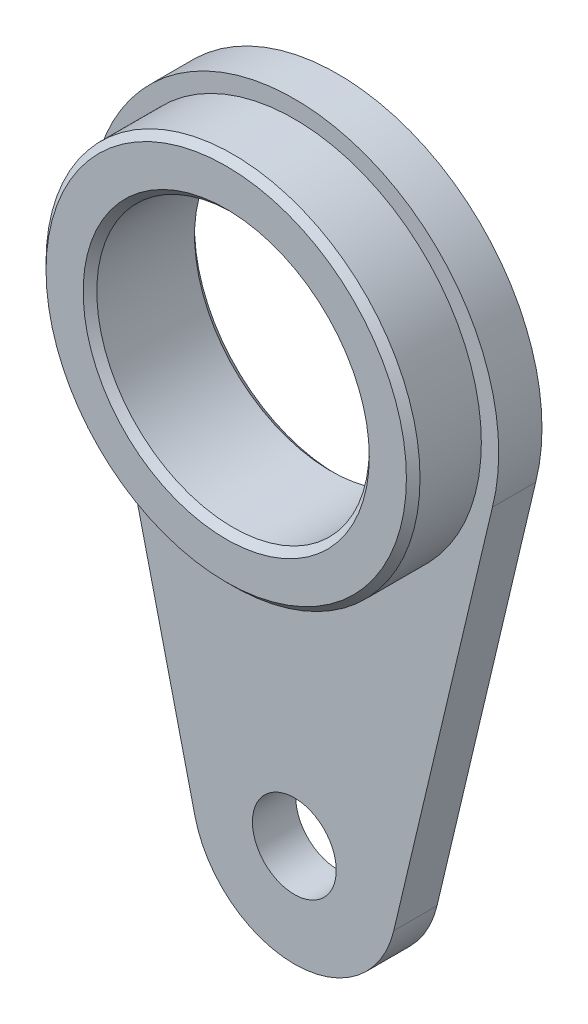
ISO-10303-21;
HEADER;
FILE_DESCRIPTION(('STEP AP214'),'2;1');
FILE_NAME('part.step','',(''),(''),'','','');
FILE_SCHEMA(('AUTOMOTIVE_DESIGN { 1 0 10303 214 1 1 1 1 }'));
ENDSEC;
DATA;
#1=APPLICATION_CONTEXT('core data for automotive mechanical design processes');
#2=APPLICATION_PROTOCOL_DEFINITION('international standard','automotive_design',2000,#1);
#3=PRODUCT_CONTEXT('',#1,'mechanical');
#4=PRODUCT('Part','Part','',(#3));
#5=PRODUCT_RELATED_PRODUCT_CATEGORY('part','',(#4));
#6=PRODUCT_DEFINITION_FORMATION('','',#4);
#7=PRODUCT_DEFINITION_CONTEXT('part definition',#1,'design');
#8=PRODUCT_DEFINITION('design','',#6,#7);
#9=PRODUCT_DEFINITION_SHAPE('','',#8);
#10=(LENGTH_UNIT() NAMED_UNIT(*) SI_UNIT(.MILLI.,.METRE.));
#11=(NAMED_UNIT(*) PLANE_ANGLE_UNIT() SI_UNIT($,.RADIAN.));
#12=(NAMED_UNIT(*) SI_UNIT($,.STERADIAN.) SOLID_ANGLE_UNIT());
#13=UNCERTAINTY_MEASURE_WITH_UNIT(LENGTH_MEASURE(1.E-05),#10,'distance_accuracy_value','');
#14=(GEOMETRIC_REPRESENTATION_CONTEXT(3) GLOBAL_UNCERTAINTY_ASSIGNED_CONTEXT((#13)) GLOBAL_UNIT_ASSIGNED_CONTEXT((#10,
#11,#12)) REPRESENTATION_CONTEXT('',''));
#15=CARTESIAN_POINT('',(0.,0.,0.));
#16=DIRECTION('',(0.,0.,1.));
#17=DIRECTION('',(1.,0.,0.));
#18=AXIS2_PLACEMENT_3D('',#15,#16,#17);
#19=CARTESIAN_POINT('',(0.,0.,6.35));
#20=DIRECTION('',(0.,0.,1.));
#21=DIRECTION('',(1.,0.,0.));
#22=AXIS2_PLACEMENT_3D('',#19,#20,#21);
#23=PLANE('',#22);
#24=CARTESIAN_POINT('',(0.,0.,6.34999999999999));
#25=DIRECTION('',(0.,0.,1.));
#26=DIRECTION('',(1.,0.,0.));
#27=AXIS2_PLACEMENT_3D('',#24,#25,#26);
#28=CIRCLE('',#27,27.45);
#29=CARTESIAN_POINT('',(27.4499999999998,0.,6.34999999999999));
#30=VERTEX_POINT('',#29);
#31=EDGE_CURVE('E128',#30,#30,#28,.T.);
#32=ORIENTED_EDGE('',*,*,#31,.F.);
#33=EDGE_LOOP('',(#32));
#34=FACE_BOUND('',#33,.T.);
#35=CARTESIAN_POINT('',(0.,0.,6.35));
#36=DIRECTION('',(0.,0.,1.));
#37=DIRECTION('',(1.,0.,0.));
#38=AXIS2_PLACEMENT_3D('',#35,#36,#37);
#39=CIRCLE('',#38,30.);
#40=CARTESIAN_POINT('',(29.0780134048297,-7.38032088926599,6.34999999999999));
#41=VERTEX_POINT('',#40);
#42=CARTESIAN_POINT('',(-29.0780134048301,-7.38032088926599,6.35));
#43=VERTEX_POINT('',#42);
#44=EDGE_CURVE('E103',#41,#43,#39,.T.);
#45=ORIENTED_EDGE('',*,*,#44,.T.);
#46=DIRECTION('',(0.230711965147028,-0.973022090775948,0.));
#47=VECTOR('',#46,1.);
#48=CARTESIAN_POINT('',(-29.0780134048301,-7.38032088926599,6.35));
#49=LINE('',#48,#47);
#50=CARTESIAN_POINT('',(-14.5953313616395,-68.4606794772056,6.34999999999999));
#51=VERTEX_POINT('',#50);
#52=EDGE_CURVE('E98',#43,#51,#49,.T.);
#53=ORIENTED_EDGE('',*,*,#52,.T.);
#54=CARTESIAN_POINT('',(-2.22044604925031E-13,-65.0000000000002,6.35));
#55=DIRECTION('',(0.,0.,1.));
#56=DIRECTION('',(1.,0.,0.));
#57=AXIS2_PLACEMENT_3D('',#54,#55,#56);
#58=CIRCLE('',#57,15.);
#59=CARTESIAN_POINT('',(14.5953313616388,-68.4606794772054,6.34999999999999));
#60=VERTEX_POINT('',#59);
#61=EDGE_CURVE('E101',#51,#60,#58,.T.);
#62=ORIENTED_EDGE('',*,*,#61,.T.);
#63=DIRECTION('',(0.230711965147028,0.973022090775948,0.));
#64=VECTOR('',#63,1.);
#65=CARTESIAN_POINT('',(14.5953313616388,-68.4606794772054,6.34999999999999));
#66=LINE('',#65,#64);
#67=EDGE_CURVE('E67',#60,#41,#66,.T.);
#68=ORIENTED_EDGE('',*,*,#67,.T.);
#69=EDGE_LOOP('',(#45,#53,#62,#68));
#70=FACE_BOUND('',#69,.T.);
#71=CARTESIAN_POINT('',(-2.22044604925031E-13,-65.0000000000002,6.35));
#72=DIRECTION('',(0.,0.,1.));
#73=DIRECTION('',(1.,0.,0.));
#74=AXIS2_PLACEMENT_3D('',#71,#72,#73);
#75=CIRCLE('',#74,6.15);
#76=CARTESIAN_POINT('',(-6.15000000000022,-65.0000000000002,6.35));
#77=VERTEX_POINT('',#76);
#78=EDGE_CURVE('E121',#77,#77,#75,.T.);
#79=ORIENTED_EDGE('',*,*,#78,.F.);
#80=EDGE_LOOP('',(#79));
#81=FACE_BOUND('',#80,.T.);
#82=ADVANCED_FACE('F50',(#34,#70,#81),#23,.T.);
#83=CARTESIAN_POINT('',(0.,0.,0.));
#84=DIRECTION('',(0.,0.,1.));
#85=DIRECTION('',(1.,0.,0.));
#86=AXIS2_PLACEMENT_3D('',#83,#84,#85);
#87=PLANE('',#86);
#88=CARTESIAN_POINT('',(0.,0.,0.));
#89=DIRECTION('',(0.,0.,1.));
#90=DIRECTION('',(1.,0.,0.));
#91=AXIS2_PLACEMENT_3D('',#88,#89,#90);
#92=CIRCLE('',#91,21.);
#93=CARTESIAN_POINT('',(21.,0.,0.));
#94=VERTEX_POINT('',#93);
#95=EDGE_CURVE('E135',#94,#94,#92,.T.);
#96=ORIENTED_EDGE('',*,*,#95,.T.);
#97=EDGE_LOOP('',(#96));
#98=FACE_BOUND('',#97,.T.);
#99=CARTESIAN_POINT('',(0.,0.,0.));
#100=DIRECTION('',(0.,0.,1.));
#101=DIRECTION('',(1.,0.,0.));
#102=AXIS2_PLACEMENT_3D('',#99,#100,#101);
#103=CIRCLE('',#102,30.);
#104=CARTESIAN_POINT('',(29.07801340483,-7.38032088926577,0.));
#105=VERTEX_POINT('',#104);
#106=CARTESIAN_POINT('',(-29.0780134048298,-7.38032088926599,0.));
#107=VERTEX_POINT('',#106);
#108=EDGE_CURVE('E118',#105,#107,#103,.T.);
#109=ORIENTED_EDGE('',*,*,#108,.F.);
#110=DIRECTION('',(0.230711965147028,0.973022090775948,0.));
#111=VECTOR('',#110,1.);
#112=CARTESIAN_POINT('',(14.595331361639,-68.4606794772056,0.));
#113=LINE('',#112,#111);
#114=CARTESIAN_POINT('',(14.595331361639,-68.4606794772056,0.));
#115=VERTEX_POINT('',#114);
#116=EDGE_CURVE('E90',#115,#105,#113,.T.);
#117=ORIENTED_EDGE('',*,*,#116,.F.);
#118=CARTESIAN_POINT('',(1.11022302462516E-13,-65.0000000000004,0.));
#119=DIRECTION('',(0.,0.,1.));
#120=DIRECTION('',(1.,0.,0.));
#121=AXIS2_PLACEMENT_3D('',#118,#119,#120);
#122=CIRCLE('',#121,15.);
#123=CARTESIAN_POINT('',(-14.5953313616392,-68.4606794772058,0.));
#124=VERTEX_POINT('',#123);
#125=EDGE_CURVE('E84',#124,#115,#122,.T.);
#126=ORIENTED_EDGE('',*,*,#125,.F.);
#127=DIRECTION('',(0.230711965147028,-0.973022090775948,0.));
#128=VECTOR('',#127,1.);
#129=CARTESIAN_POINT('',(-29.0780134048298,-7.38032088926599,0.));
#130=LINE('',#129,#128);
#131=EDGE_CURVE('E108',#107,#124,#130,.T.);
#132=ORIENTED_EDGE('',*,*,#131,.F.);
#133=EDGE_LOOP('',(#109,#117,#126,#132));
#134=FACE_BOUND('',#133,.T.);
#135=CARTESIAN_POINT('',(1.11022302462516E-13,-65.0000000000004,0.));
#136=DIRECTION('',(0.,0.,1.));
#137=DIRECTION('',(1.,0.,0.));
#138=AXIS2_PLACEMENT_3D('',#135,#136,#137);
#139=CIRCLE('',#138,6.15);
#140=CARTESIAN_POINT('',(-6.15000000000022,-65.0000000000002,0.));
#141=VERTEX_POINT('',#140);
#142=EDGE_CURVE('E200',#141,#141,#139,.T.);
#143=ORIENTED_EDGE('',*,*,#142,.T.);
#144=EDGE_LOOP('',(#143));
#145=FACE_BOUND('',#144,.T.);
#146=ADVANCED_FACE('F166',(#98,#134,#145),#87,.F.);
#147=CARTESIAN_POINT('',(0.,0.,6.35));
#148=DIRECTION('',(0.,0.,-1.));
#149=DIRECTION('',(-1.,0.,0.));
#150=AXIS2_PLACEMENT_3D('',#147,#148,#149);
#151=CYLINDRICAL_SURFACE('',#150,30.);
#152=ORIENTED_EDGE('',*,*,#108,.T.);
#153=DIRECTION('',(0.,0.,-1.));
#154=VECTOR('',#153,1.);
#155=CARTESIAN_POINT('',(-29.0780134048301,-7.38032088926599,6.35));
#156=LINE('',#155,#154);
#157=EDGE_CURVE('E109',#43,#107,#156,.T.);
#158=ORIENTED_EDGE('',*,*,#157,.F.);
#159=ORIENTED_EDGE('',*,*,#44,.F.);
#160=DIRECTION('',(0.,0.,-1.));
#161=VECTOR('',#160,1.);
#162=CARTESIAN_POINT('',(29.0780134048297,-7.38032088926599,6.34999999999999));
#163=LINE('',#162,#161);
#164=EDGE_CURVE('E114',#41,#105,#163,.T.);
#165=ORIENTED_EDGE('',*,*,#164,.T.);
#166=EDGE_LOOP('',(#152,#158,#159,#165));
#167=FACE_BOUND('',#166,.T.);
#168=ADVANCED_FACE('F172',(#167),#151,.T.);
#169=CARTESIAN_POINT('',(-29.0780134048301,-7.38032088926599,6.35));
#170=DIRECTION('',(0.973022090775948,0.230711965147028,0.));
#171=DIRECTION('',(-0.230711965147028,0.973022090775948,0.));
#172=AXIS2_PLACEMENT_3D('',#169,#170,#171);
#173=PLANE('',#172);
#174=ORIENTED_EDGE('',*,*,#131,.T.);
#175=DIRECTION('',(0.,0.,-1.));
#176=VECTOR('',#175,1.);
#177=CARTESIAN_POINT('',(-14.5953313616395,-68.4606794772056,6.34999999999999));
#178=LINE('',#177,#176);
#179=EDGE_CURVE('E106',#51,#124,#178,.T.);
#180=ORIENTED_EDGE('',*,*,#179,.F.);
#181=ORIENTED_EDGE('',*,*,#52,.F.);
#182=ORIENTED_EDGE('',*,*,#157,.T.);
#183=EDGE_LOOP('',(#174,#180,#181,#182));
#184=FACE_BOUND('',#183,.T.);
#185=ADVANCED_FACE('F107',(#184),#173,.F.);
#186=CARTESIAN_POINT('',(-2.22044604925031E-13,-65.0000000000002,6.35));
#187=DIRECTION('',(0.,0.,-1.));
#188=DIRECTION('',(-1.,0.,0.));
#189=AXIS2_PLACEMENT_3D('',#186,#187,#188);
#190=CYLINDRICAL_SURFACE('',#189,15.);
#191=ORIENTED_EDGE('',*,*,#125,.T.);
#192=DIRECTION('',(0.,0.,-1.));
#193=VECTOR('',#192,1.);
#194=CARTESIAN_POINT('',(14.5953313616388,-68.4606794772054,6.34999999999999));
#195=LINE('',#194,#193);
#196=EDGE_CURVE('E110',#60,#115,#195,.T.);
#197=ORIENTED_EDGE('',*,*,#196,.F.);
#198=ORIENTED_EDGE('',*,*,#61,.F.);
#199=ORIENTED_EDGE('',*,*,#179,.T.);
#200=EDGE_LOOP('',(#191,#197,#198,#199));
#201=FACE_BOUND('',#200,.T.);
#202=ADVANCED_FACE('F112',(#201),#190,.T.);
#203=CARTESIAN_POINT('',(14.5953313616388,-68.4606794772054,6.34999999999999));
#204=DIRECTION('',(-0.973022090775948,0.230711965147028,0.));
#205=DIRECTION('',(-0.230711965147028,-0.973022090775948,0.));
#206=AXIS2_PLACEMENT_3D('',#203,#204,#205);
#207=PLANE('',#206);
#208=ORIENTED_EDGE('',*,*,#116,.T.);
#209=ORIENTED_EDGE('',*,*,#164,.F.);
#210=ORIENTED_EDGE('',*,*,#67,.F.);
#211=ORIENTED_EDGE('',*,*,#196,.T.);
#212=EDGE_LOOP('',(#208,#209,#210,#211));
#213=FACE_BOUND('',#212,.T.);
#214=ADVANCED_FACE('F178',(#213),#207,.F.);
#215=CARTESIAN_POINT('',(-2.22044604925031E-13,-65.0000000000002,6.35));
#216=DIRECTION('',(0.,0.,-1.));
#217=DIRECTION('',(-1.,0.,0.));
#218=AXIS2_PLACEMENT_3D('',#215,#216,#217);
#219=CYLINDRICAL_SURFACE('',#218,6.15);
#220=CARTESIAN_POINT('',(-6.15000000000022,-65.0000000000002,6.35));
#221=CARTESIAN_POINT('',(-6.15000000000022,-65.0000000000002,6.28385416666666));
#222=CARTESIAN_POINT('',(-6.15000000000022,-65.0000000000002,6.21770833333333));
#223=CARTESIAN_POINT('',(-6.15000000000022,-65.0000000000002,6.08541666666666));
#224=CARTESIAN_POINT('',(-6.15000000000022,-65.0000000000002,6.01927083333333));
#225=CARTESIAN_POINT('',(-6.15000000000022,-65.0000000000002,5.88697916666666));
#226=CARTESIAN_POINT('',(-6.15000000000022,-65.0000000000002,5.82083333333333));
#227=CARTESIAN_POINT('',(-6.15000000000022,-65.0000000000002,5.68854166666666));
#228=CARTESIAN_POINT('',(-6.15000000000022,-65.0000000000002,5.62239583333333));
#229=CARTESIAN_POINT('',(-6.15000000000022,-65.0000000000002,5.49010416666666));
#230=CARTESIAN_POINT('',(-6.15000000000022,-65.0000000000002,5.42395833333333));
#231=CARTESIAN_POINT('',(-6.15000000000022,-65.0000000000002,5.29166666666666));
#232=CARTESIAN_POINT('',(-6.15000000000022,-65.0000000000002,5.22552083333333));
#233=CARTESIAN_POINT('',(-6.15000000000022,-65.0000000000002,5.09322916666666));
#234=CARTESIAN_POINT('',(-6.15000000000022,-65.0000000000002,5.02708333333333));
#235=CARTESIAN_POINT('',(-6.15000000000022,-65.0000000000002,4.89479166666666));
#236=CARTESIAN_POINT('',(-6.15000000000022,-65.0000000000002,4.82864583333333));
#237=CARTESIAN_POINT('',(-6.15000000000022,-65.0000000000002,4.69635416666666));
#238=CARTESIAN_POINT('',(-6.15000000000022,-65.0000000000002,4.63020833333333));
#239=CARTESIAN_POINT('',(-6.15000000000022,-65.0000000000002,4.49791666666666));
#240=CARTESIAN_POINT('',(-6.15000000000022,-65.0000000000002,4.43177083333333));
#241=CARTESIAN_POINT('',(-6.15000000000022,-65.0000000000002,4.29947916666666));
#242=CARTESIAN_POINT('',(-6.15000000000022,-65.0000000000002,4.23333333333333));
#243=CARTESIAN_POINT('',(-6.15000000000022,-65.0000000000002,4.10104166666666));
#244=CARTESIAN_POINT('',(-6.15000000000022,-65.0000000000002,4.03489583333333));
#245=CARTESIAN_POINT('',(-6.15000000000022,-65.0000000000002,3.90260416666666));
#246=CARTESIAN_POINT('',(-6.15000000000022,-65.0000000000002,3.83645833333333));
#247=CARTESIAN_POINT('',(-6.15000000000022,-65.0000000000002,3.70416666666666));
#248=CARTESIAN_POINT('',(-6.15000000000022,-65.0000000000002,3.63802083333333));
#249=CARTESIAN_POINT('',(-6.15000000000022,-65.0000000000002,3.50572916666666));
#250=CARTESIAN_POINT('',(-6.15000000000022,-65.0000000000002,3.43958333333333));
#251=CARTESIAN_POINT('',(-6.15000000000022,-65.0000000000002,3.30729166666666));
#252=CARTESIAN_POINT('',(-6.15000000000022,-65.0000000000002,3.24114583333333));
#253=CARTESIAN_POINT('',(-6.15000000000022,-65.0000000000002,3.10885416666666));
#254=CARTESIAN_POINT('',(-6.15000000000022,-65.0000000000002,3.04270833333333));
#255=CARTESIAN_POINT('',(-6.15000000000022,-65.0000000000002,2.91041666666666));
#256=CARTESIAN_POINT('',(-6.15000000000022,-65.0000000000002,2.84427083333333));
#257=CARTESIAN_POINT('',(-6.15000000000022,-65.0000000000002,2.71197916666666));
#258=CARTESIAN_POINT('',(-6.15000000000022,-65.0000000000002,2.64583333333333));
#259=CARTESIAN_POINT('',(-6.15000000000022,-65.0000000000002,2.51354166666666));
#260=CARTESIAN_POINT('',(-6.15000000000022,-65.0000000000002,2.44739583333333));
#261=CARTESIAN_POINT('',(-6.15000000000022,-65.0000000000002,2.31510416666666));
#262=CARTESIAN_POINT('',(-6.15000000000022,-65.0000000000002,2.24895833333333));
#263=CARTESIAN_POINT('',(-6.15000000000022,-65.0000000000002,2.11666666666666));
#264=CARTESIAN_POINT('',(-6.15000000000022,-65.0000000000002,2.05052083333333));
#265=CARTESIAN_POINT('',(-6.15000000000022,-65.0000000000002,1.91822916666666));
#266=CARTESIAN_POINT('',(-6.15000000000022,-65.0000000000002,1.85208333333333));
#267=CARTESIAN_POINT('',(-6.15000000000022,-65.0000000000002,1.71979166666666));
#268=CARTESIAN_POINT('',(-6.15000000000022,-65.0000000000002,1.65364583333333));
#269=CARTESIAN_POINT('',(-6.15000000000022,-65.0000000000002,1.52135416666666));
#270=CARTESIAN_POINT('',(-6.15000000000022,-65.0000000000002,1.45520833333333));
#271=CARTESIAN_POINT('',(-6.15000000000022,-65.0000000000002,1.32291666666666));
#272=CARTESIAN_POINT('',(-6.15000000000022,-65.0000000000002,1.25677083333333));
#273=CARTESIAN_POINT('',(-6.15000000000022,-65.0000000000002,1.12447916666666));
#274=CARTESIAN_POINT('',(-6.15000000000022,-65.0000000000002,1.05833333333333));
#275=CARTESIAN_POINT('',(-6.15000000000022,-65.0000000000002,0.92604166666666));
#276=CARTESIAN_POINT('',(-6.15000000000022,-65.0000000000002,0.859895833333327));
#277=CARTESIAN_POINT('',(-6.15000000000022,-65.0000000000002,0.72760416666666));
#278=CARTESIAN_POINT('',(-6.15000000000022,-65.0000000000002,0.661458333333326));
#279=CARTESIAN_POINT('',(-6.15000000000022,-65.0000000000002,0.529166666666659));
#280=CARTESIAN_POINT('',(-6.15000000000022,-65.0000000000002,0.463020833333326));
#281=CARTESIAN_POINT('',(-6.15000000000022,-65.0000000000002,0.330729166666659));
#282=CARTESIAN_POINT('',(-6.15000000000022,-65.0000000000002,0.264583333333326));
#283=CARTESIAN_POINT('',(-6.15000000000022,-65.0000000000002,0.132291666666659));
#284=CARTESIAN_POINT('',(-6.15000000000022,-65.0000000000002,0.0661458333333256));
#285=CARTESIAN_POINT('',(-6.15000000000022,-65.0000000000002,0.));
#286=B_SPLINE_CURVE_WITH_KNOTS('',3,(#220,#221,#222,#223,#224,#225,#226,#227,#228,#229,#230,
#231,#232,#233,#234,#235,#236,#237,#238,#239,#240,#241,#242,#243,#244,#245,#246,#247,#248,#249,
#250,#251,#252,#253,#254,#255,#256,#257,#258,#259,#260,#261,#262,#263,#264,#265,#266,#267,#268,
#269,#270,#271,#272,#273,#274,#275,#276,#277,#278,#279,#280,#281,#282,#283,#284,#285),
.UNSPECIFIED.,.F.,.F.,(4,2,2,2,2,2,2,2,2,2,2,2,2,2,2,2,2,2,2,2,2,2,2,2,2,2,2,2,2,2,2,2,4),(0.,
0.198437500000001,0.396875000000001,0.595312500000001,0.793750000000001,0.992187500000002,
1.190625,1.3890625,1.5875,1.7859375,1.984375,2.1828125,2.38125,2.5796875,2.778125,2.9765625,
3.175,3.3734375,3.571875,3.7703125,3.96875,4.1671875,4.365625,4.5640625,4.7625,4.9609375,
5.159375,5.3578125,5.55625,5.75468750000001,5.95312500000001,6.15156250000001,6.35000000000001),.UNSPECIFIED.);
#287=EDGE_CURVE('BSEAM162',#77,#141,#286,.T.);
#288=ORIENTED_EDGE('',*,*,#78,.T.);
#289=ORIENTED_EDGE('',*,*,#142,.F.);
#290=ORIENTED_EDGE('',*,*,#287,.T.);
#291=ORIENTED_EDGE('',*,*,#287,.F.);
#292=EDGE_LOOP('',(#288,#290,#289,#291));
#293=FACE_BOUND('',#292,.T.);
#294=ADVANCED_FACE('F162',(#293),#219,.F.);
#295=CARTESIAN_POINT('',(-2.22044604925031E-13,0.,-77.6403245742829));
#296=DIRECTION('',(0.,0.,1.));
#297=DIRECTION('',(1.,0.,0.));
#298=AXIS2_PLACEMENT_3D('',#295,#296,#297);
#299=CYLINDRICAL_SURFACE('',#298,27.45);
#300=CARTESIAN_POINT('',(-1.11022302462516E-13,0.,15.35));
#301=DIRECTION('',(0.,0.,1.));
#302=DIRECTION('',(1.,0.,0.));
#303=AXIS2_PLACEMENT_3D('',#300,#301,#302);
#304=CIRCLE('',#303,27.45);
#305=CARTESIAN_POINT('',(27.4499999999998,0.,15.35));
#306=VERTEX_POINT('',#305);
#307=EDGE_CURVE('E13',#306,#306,#304,.F.);
#308=CARTESIAN_POINT('',(27.4499999999998,0.,15.35));
#309=CARTESIAN_POINT('',(27.4499999999998,0.,15.25625));
#310=CARTESIAN_POINT('',(27.4499999999998,0.,15.1625));
#311=CARTESIAN_POINT('',(27.4499999999998,0.,14.975));
#312=CARTESIAN_POINT('',(27.4499999999998,0.,14.88125));
#313=CARTESIAN_POINT('',(27.4499999999998,0.,14.69375));
#314=CARTESIAN_POINT('',(27.4499999999998,0.,14.6));
#315=CARTESIAN_POINT('',(27.4499999999998,0.,14.4125));
#316=CARTESIAN_POINT('',(27.4499999999998,0.,14.31875));
#317=CARTESIAN_POINT('',(27.4499999999998,0.,14.13125));
#318=CARTESIAN_POINT('',(27.4499999999998,0.,14.0375));
#319=CARTESIAN_POINT('',(27.4499999999998,0.,13.85));
#320=CARTESIAN_POINT('',(27.4499999999998,0.,13.75625));
#321=CARTESIAN_POINT('',(27.4499999999998,0.,13.56875));
#322=CARTESIAN_POINT('',(27.4499999999998,0.,13.475));
#323=CARTESIAN_POINT('',(27.4499999999998,0.,13.2875));
#324=CARTESIAN_POINT('',(27.4499999999998,0.,13.19375));
#325=CARTESIAN_POINT('',(27.4499999999998,0.,13.00625));
#326=CARTESIAN_POINT('',(27.4499999999998,0.,12.9125));
#327=CARTESIAN_POINT('',(27.4499999999998,0.,12.725));
#328=CARTESIAN_POINT('',(27.4499999999998,0.,12.63125));
#329=CARTESIAN_POINT('',(27.4499999999998,0.,12.44375));
#330=CARTESIAN_POINT('',(27.4499999999998,0.,12.35));
#331=CARTESIAN_POINT('',(27.4499999999998,0.,12.1625));
#332=CARTESIAN_POINT('',(27.4499999999998,0.,12.06875));
#333=CARTESIAN_POINT('',(27.4499999999998,0.,11.88125));
#334=CARTESIAN_POINT('',(27.4499999999998,0.,11.7875));
#335=CARTESIAN_POINT('',(27.4499999999998,0.,11.6));
#336=CARTESIAN_POINT('',(27.4499999999998,0.,11.50625));
#337=CARTESIAN_POINT('',(27.4499999999998,0.,11.31875));
#338=CARTESIAN_POINT('',(27.4499999999998,0.,11.225));
#339=CARTESIAN_POINT('',(27.4499999999998,0.,11.0375));
#340=CARTESIAN_POINT('',(27.4499999999998,0.,10.94375));
#341=CARTESIAN_POINT('',(27.4499999999998,0.,10.75625));
#342=CARTESIAN_POINT('',(27.4499999999998,0.,10.6625));
#343=CARTESIAN_POINT('',(27.4499999999998,0.,10.475));
#344=CARTESIAN_POINT('',(27.4499999999998,0.,10.38125));
#345=CARTESIAN_POINT('',(27.4499999999998,0.,10.19375));
#346=CARTESIAN_POINT('',(27.4499999999998,0.,10.1));
#347=CARTESIAN_POINT('',(27.4499999999998,0.,9.9125));
#348=CARTESIAN_POINT('',(27.4499999999998,0.,9.81875));
#349=CARTESIAN_POINT('',(27.4499999999998,0.,9.63125));
#350=CARTESIAN_POINT('',(27.4499999999998,0.,9.5375));
#351=CARTESIAN_POINT('',(27.4499999999998,0.,9.35));
#352=CARTESIAN_POINT('',(27.4499999999998,0.,9.25624999999999));
#353=CARTESIAN_POINT('',(27.4499999999998,0.,9.06874999999999));
#354=CARTESIAN_POINT('',(27.4499999999998,0.,8.97499999999999));
#355=CARTESIAN_POINT('',(27.4499999999998,0.,8.78749999999999));
#356=CARTESIAN_POINT('',(27.4499999999998,0.,8.69374999999999));
#357=CARTESIAN_POINT('',(27.4499999999998,0.,8.50625));
#358=CARTESIAN_POINT('',(27.4499999999998,0.,8.4125));
#359=CARTESIAN_POINT('',(27.4499999999998,0.,8.225));
#360=CARTESIAN_POINT('',(27.4499999999998,0.,8.13125));
#361=CARTESIAN_POINT('',(27.4499999999998,0.,7.94375));
#362=CARTESIAN_POINT('',(27.4499999999998,0.,7.85));
#363=CARTESIAN_POINT('',(27.4499999999998,0.,7.66249999999999));
#364=CARTESIAN_POINT('',(27.4499999999998,0.,7.56874999999999));
#365=CARTESIAN_POINT('',(27.4499999999998,0.,7.38125));
#366=CARTESIAN_POINT('',(27.4499999999998,0.,7.2875));
#367=CARTESIAN_POINT('',(27.4499999999998,0.,7.1));
#368=CARTESIAN_POINT('',(27.4499999999998,0.,7.00624999999999));
#369=CARTESIAN_POINT('',(27.4499999999998,0.,6.81874999999999));
#370=CARTESIAN_POINT('',(27.4499999999998,0.,6.72499999999999));
#371=CARTESIAN_POINT('',(27.4499999999998,0.,6.53749999999999));
#372=CARTESIAN_POINT('',(27.4499999999998,0.,6.44374999999999));
#373=CARTESIAN_POINT('',(27.4499999999998,0.,6.34999999999999));
#374=B_SPLINE_CURVE_WITH_KNOTS('',3,(#308,#309,#310,#311,#312,#313,#314,#315,#316,#317,#318,
#319,#320,#321,#322,#323,#324,#325,#326,#327,#328,#329,#330,#331,#332,#333,#334,#335,#336,#337,
#338,#339,#340,#341,#342,#343,#344,#345,#346,#347,#348,#349,#350,#351,#352,#353,#354,#355,#356,
#357,#358,#359,#360,#361,#362,#363,#364,#365,#366,#367,#368,#369,#370,#371,#372,#373),
.UNSPECIFIED.,.F.,.F.,(4,2,2,2,2,2,2,2,2,2,2,2,2,2,2,2,2,2,2,2,2,2,2,2,2,2,2,2,2,2,2,2,4),(0.,
0.281249999999997,0.562499999999994,0.843750000000004,1.125,1.40625,1.68750000000001,
1.96875000000001,2.25,2.53125,2.8125,3.09375000000001,3.375,3.65625,3.93750000000001,
4.21875000000001,4.5,4.78125,5.0625,5.34375000000001,5.62500000000001,5.90625,6.18750000000001,
6.46875000000001,6.75000000000001,7.03125,7.3125,7.59375000000001,7.87500000000001,8.15625,
8.43750000000001,8.71875000000001,9.00000000000001),.UNSPECIFIED.);
#375=EDGE_CURVE('BSEAM154',#306,#30,#374,.T.);
#376=ORIENTED_EDGE('',*,*,#307,.T.);
#377=ORIENTED_EDGE('',*,*,#31,.T.);
#378=ORIENTED_EDGE('',*,*,#375,.T.);
#379=ORIENTED_EDGE('',*,*,#375,.F.);
#380=EDGE_LOOP('',(#376,#378,#377,#379));
#381=FACE_BOUND('',#380,.T.);
#382=ADVANCED_FACE('F154',(#381),#299,.T.);
#383=CARTESIAN_POINT('',(-2.22044604925031E-13,0.,-77.6403245742829));
#384=DIRECTION('',(0.,0.,1.));
#385=DIRECTION('',(1.,0.,0.));
#386=AXIS2_PLACEMENT_3D('',#383,#384,#385);
#387=CYLINDRICAL_SURFACE('',#386,20.);
#388=CARTESIAN_POINT('',(0.,0.,0.999999999999973));
#389=DIRECTION('',(0.,0.,1.));
#390=DIRECTION('',(1.,0.,0.));
#391=AXIS2_PLACEMENT_3D('',#388,#389,#390);
#392=CIRCLE('',#391,20.);
#393=CARTESIAN_POINT('',(19.9999999999998,0.,0.999999999999973));
#394=VERTEX_POINT('',#393);
#395=EDGE_CURVE('E132',#394,#394,#392,.F.);
#396=CARTESIAN_POINT('',(-1.11022302462516E-13,0.,15.35));
#397=DIRECTION('',(0.,0.,1.));
#398=DIRECTION('',(1.,0.,0.));
#399=AXIS2_PLACEMENT_3D('',#396,#397,#398);
#400=CIRCLE('',#399,20.);
#401=CARTESIAN_POINT('',(19.9999999999998,0.,15.35));
#402=VERTEX_POINT('',#401);
#403=EDGE_CURVE('E129',#402,#402,#400,.T.);
#404=CARTESIAN_POINT('',(19.9999999999998,0.,0.999999999999973));
#405=CARTESIAN_POINT('',(19.9999999999998,0.,1.14947916666664));
#406=CARTESIAN_POINT('',(19.9999999999998,0.,1.2989583333333));
#407=CARTESIAN_POINT('',(19.9999999999998,0.,1.59791666666664));
#408=CARTESIAN_POINT('',(19.9999999999998,0.,1.74739583333331));
#409=CARTESIAN_POINT('',(19.9999999999998,0.,2.04635416666664));
#410=CARTESIAN_POINT('',(19.9999999999998,0.,2.19583333333331));
#411=CARTESIAN_POINT('',(19.9999999999998,0.,2.49479166666664));
#412=CARTESIAN_POINT('',(19.9999999999998,0.,2.6442708333333));
#413=CARTESIAN_POINT('',(19.9999999999998,0.,2.94322916666664));
#414=CARTESIAN_POINT('',(19.9999999999998,0.,3.09270833333331));
#415=CARTESIAN_POINT('',(19.9999999999998,0.,3.39166666666664));
#416=CARTESIAN_POINT('',(19.9999999999998,0.,3.54114583333331));
#417=CARTESIAN_POINT('',(19.9999999999998,0.,3.84010416666664));
#418=CARTESIAN_POINT('',(19.9999999999998,0.,3.98958333333331));
#419=CARTESIAN_POINT('',(19.9999999999998,0.,4.28854166666664));
#420=CARTESIAN_POINT('',(19.9999999999998,0.,4.4380208333333));
#421=CARTESIAN_POINT('',(19.9999999999998,0.,4.73697916666664));
#422=CARTESIAN_POINT('',(19.9999999999998,0.,4.88645833333331));
#423=CARTESIAN_POINT('',(19.9999999999998,0.,5.18541666666664));
#424=CARTESIAN_POINT('',(19.9999999999998,0.,5.33489583333331));
#425=CARTESIAN_POINT('',(19.9999999999998,0.,5.63385416666664));
#426=CARTESIAN_POINT('',(19.9999999999998,0.,5.7833333333333));
#427=CARTESIAN_POINT('',(19.9999999999998,0.,6.08229166666664));
#428=CARTESIAN_POINT('',(19.9999999999998,0.,6.23177083333331));
#429=CARTESIAN_POINT('',(19.9999999999998,0.,6.53072916666664));
#430=CARTESIAN_POINT('',(19.9999999999998,0.,6.68020833333331));
#431=CARTESIAN_POINT('',(19.9999999999998,0.,6.97916666666664));
#432=CARTESIAN_POINT('',(19.9999999999998,0.,7.1286458333333));
#433=CARTESIAN_POINT('',(19.9999999999998,0.,7.42760416666664));
#434=CARTESIAN_POINT('',(19.9999999999998,0.,7.57708333333331));
#435=CARTESIAN_POINT('',(19.9999999999998,0.,7.87604166666664));
#436=CARTESIAN_POINT('',(19.9999999999998,0.,8.02552083333331));
#437=CARTESIAN_POINT('',(19.9999999999998,0.,8.32447916666664));
#438=CARTESIAN_POINT('',(19.9999999999998,0.,8.4739583333333));
#439=CARTESIAN_POINT('',(19.9999999999998,0.,8.77291666666664));
#440=CARTESIAN_POINT('',(19.9999999999998,0.,8.92239583333331));
#441=CARTESIAN_POINT('',(19.9999999999998,0.,9.22135416666664));
#442=CARTESIAN_POINT('',(19.9999999999998,0.,9.37083333333331));
#443=CARTESIAN_POINT('',(19.9999999999998,0.,9.66979166666664));
#444=CARTESIAN_POINT('',(19.9999999999998,0.,9.8192708333333));
#445=CARTESIAN_POINT('',(19.9999999999998,0.,10.1182291666666));
#446=CARTESIAN_POINT('',(19.9999999999998,0.,10.2677083333333));
#447=CARTESIAN_POINT('',(19.9999999999998,0.,10.5666666666666));
#448=CARTESIAN_POINT('',(19.9999999999998,0.,10.7161458333333));
#449=CARTESIAN_POINT('',(19.9999999999998,0.,11.0151041666666));
#450=CARTESIAN_POINT('',(19.9999999999998,0.,11.1645833333333));
#451=CARTESIAN_POINT('',(19.9999999999998,0.,11.4635416666666));
#452=CARTESIAN_POINT('',(19.9999999999998,0.,11.6130208333333));
#453=CARTESIAN_POINT('',(19.9999999999998,0.,11.9119791666666));
#454=CARTESIAN_POINT('',(19.9999999999998,0.,12.0614583333333));
#455=CARTESIAN_POINT('',(19.9999999999998,0.,12.3604166666666));
#456=CARTESIAN_POINT('',(19.9999999999998,0.,12.5098958333333));
#457=CARTESIAN_POINT('',(19.9999999999998,0.,12.8088541666666));
#458=CARTESIAN_POINT('',(19.9999999999998,0.,12.9583333333333));
#459=CARTESIAN_POINT('',(19.9999999999998,0.,13.2572916666666));
#460=CARTESIAN_POINT('',(19.9999999999998,0.,13.4067708333333));
#461=CARTESIAN_POINT('',(19.9999999999998,0.,13.7057291666666));
#462=CARTESIAN_POINT('',(19.9999999999998,0.,13.8552083333333));
#463=CARTESIAN_POINT('',(19.9999999999998,0.,14.1541666666666));
#464=CARTESIAN_POINT('',(19.9999999999998,0.,14.3036458333333));
#465=CARTESIAN_POINT('',(19.9999999999998,0.,14.6026041666666));
#466=CARTESIAN_POINT('',(19.9999999999998,0.,14.7520833333333));
#467=CARTESIAN_POINT('',(19.9999999999998,0.,15.0510416666666));
#468=CARTESIAN_POINT('',(19.9999999999998,0.,15.2005208333333));
#469=CARTESIAN_POINT('',(19.9999999999998,0.,15.35));
#470=B_SPLINE_CURVE_WITH_KNOTS('',3,(#404,#405,#406,#407,#408,#409,#410,#411,#412,#413,#414,
#415,#416,#417,#418,#419,#420,#421,#422,#423,#424,#425,#426,#427,#428,#429,#430,#431,#432,#433,
#434,#435,#436,#437,#438,#439,#440,#441,#442,#443,#444,#445,#446,#447,#448,#449,#450,#451,#452,
#453,#454,#455,#456,#457,#458,#459,#460,#461,#462,#463,#464,#465,#466,#467,#468,#469),
.UNSPECIFIED.,.F.,.F.,(4,2,2,2,2,2,2,2,2,2,2,2,2,2,2,2,2,2,2,2,2,2,2,2,2,2,2,2,2,2,2,2,4),(0.,
0.448437499999996,0.896875000000005,1.3453125,1.79375,2.24218750000001,2.690625,3.1390625,
3.58749999999999,4.0359375,4.484375,4.93281249999999,5.38125,5.8296875,6.278125,
6.72656250000001,7.175,7.6234375,8.07187500000001,8.5203125,8.96875,9.41718750000001,9.865625,
10.3140625,10.7625,11.2109375,11.659375,12.1078125,12.55625,13.0046875,13.453125,13.9015625,
14.35),.UNSPECIFIED.);
#471=EDGE_CURVE('BSEAM152',#394,#402,#470,.T.);
#472=ORIENTED_EDGE('',*,*,#395,.T.);
#473=ORIENTED_EDGE('',*,*,#403,.T.);
#474=ORIENTED_EDGE('',*,*,#471,.T.);
#475=ORIENTED_EDGE('',*,*,#471,.F.);
#476=EDGE_LOOP('',(#472,#474,#473,#475));
#477=FACE_BOUND('',#476,.T.);
#478=ADVANCED_FACE('F152',(#477),#387,.F.);
#479=CARTESIAN_POINT('',(-1.11022302462516E-13,0.,16.35));
#480=DIRECTION('',(0.,0.,1.));
#481=DIRECTION('',(1.,0.,0.));
#482=AXIS2_PLACEMENT_3D('',#479,#480,#481);
#483=PLANE('',#482);
#484=CARTESIAN_POINT('',(-1.11022302462516E-13,0.,16.35));
#485=DIRECTION('',(0.,0.,1.));
#486=DIRECTION('',(1.,0.,0.));
#487=AXIS2_PLACEMENT_3D('',#484,#485,#486);
#488=CIRCLE('',#487,21.);
#489=CARTESIAN_POINT('',(20.9999999999999,0.,16.35));
#490=VERTEX_POINT('',#489);
#491=EDGE_CURVE('E59',#490,#490,#488,.F.);
#492=ORIENTED_EDGE('',*,*,#491,.T.);
#493=EDGE_LOOP('',(#492));
#494=FACE_BOUND('',#493,.T.);
#495=CARTESIAN_POINT('',(-1.11022302462516E-13,0.,16.35));
#496=DIRECTION('',(0.,0.,1.));
#497=DIRECTION('',(1.,0.,0.));
#498=AXIS2_PLACEMENT_3D('',#495,#496,#497);
#499=CIRCLE('',#498,26.45);
#500=CARTESIAN_POINT('',(26.4499999999999,0.,16.35));
#501=VERTEX_POINT('',#500);
#502=EDGE_CURVE('E138',#501,#501,#499,.T.);
#503=ORIENTED_EDGE('',*,*,#502,.T.);
#504=EDGE_LOOP('',(#503));
#505=FACE_BOUND('',#504,.T.);
#506=ADVANCED_FACE('F143',(#494,#505),#483,.T.);
#507=CARTESIAN_POINT('',(0.,0.,0.999999999999973));
#508=DIRECTION('',(0.,0.,-1.));
#509=DIRECTION('',(-1.,0.,0.));
#510=AXIS2_PLACEMENT_3D('',#507,#508,#509);
#511=CONICAL_SURFACE('',#510,20.,0.78539816339745);
#512=ORIENTED_EDGE('',*,*,#95,.F.);
#513=EDGE_LOOP('',(#512));
#514=FACE_BOUND('',#513,.T.);
#515=ORIENTED_EDGE('',*,*,#395,.F.);
#516=EDGE_LOOP('',(#515));
#517=FACE_BOUND('',#516,.T.);
#518=ADVANCED_FACE('F149',(#514,#517),#511,.F.);
#519=CARTESIAN_POINT('',(-1.11022302462516E-13,0.,15.35));
#520=DIRECTION('',(0.,0.,1.));
#521=DIRECTION('',(1.,0.,0.));
#522=AXIS2_PLACEMENT_3D('',#519,#520,#521);
#523=CONICAL_SURFACE('',#522,20.,0.78539816339745);
#524=CARTESIAN_POINT('',(20.9999999999999,0.,16.35));
#525=CARTESIAN_POINT('',(20.9895833333333,0.,16.3395833333333));
#526=CARTESIAN_POINT('',(20.9791666666666,0.,16.3291666666667));
#527=CARTESIAN_POINT('',(20.9583333333333,0.,16.3083333333333));
#528=CARTESIAN_POINT('',(20.9479166666666,0.,16.2979166666667));
#529=CARTESIAN_POINT('',(20.9270833333333,0.,16.2770833333333));
#530=CARTESIAN_POINT('',(20.9166666666666,0.,16.2666666666667));
#531=CARTESIAN_POINT('',(20.8958333333333,0.,16.2458333333333));
#532=CARTESIAN_POINT('',(20.8854166666666,0.,16.2354166666667));
#533=CARTESIAN_POINT('',(20.8645833333332,0.,16.2145833333333));
#534=CARTESIAN_POINT('',(20.8541666666666,0.,16.2041666666667));
#535=CARTESIAN_POINT('',(20.8333333333332,0.,16.1833333333333));
#536=CARTESIAN_POINT('',(20.8229166666666,0.,16.1729166666667));
#537=CARTESIAN_POINT('',(20.8020833333332,0.,16.1520833333333));
#538=CARTESIAN_POINT('',(20.7916666666666,0.,16.1416666666667));
#539=CARTESIAN_POINT('',(20.7708333333332,0.,16.1208333333333));
#540=CARTESIAN_POINT('',(20.7604166666666,0.,16.1104166666667));
#541=CARTESIAN_POINT('',(20.7395833333332,0.,16.0895833333333));
#542=CARTESIAN_POINT('',(20.7291666666666,0.,16.0791666666667));
#543=CARTESIAN_POINT('',(20.7083333333332,0.,16.0583333333333));
#544=CARTESIAN_POINT('',(20.6979166666666,0.,16.0479166666667));
#545=CARTESIAN_POINT('',(20.6770833333332,0.,16.0270833333333));
#546=CARTESIAN_POINT('',(20.6666666666666,0.,16.0166666666667));
#547=CARTESIAN_POINT('',(20.6458333333332,0.,15.9958333333333));
#548=CARTESIAN_POINT('',(20.6354166666666,0.,15.9854166666666));
#549=CARTESIAN_POINT('',(20.6145833333332,0.,15.9645833333333));
#550=CARTESIAN_POINT('',(20.6041666666666,0.,15.9541666666666));
#551=CARTESIAN_POINT('',(20.5833333333332,0.,15.9333333333333));
#552=CARTESIAN_POINT('',(20.5729166666666,0.,15.9229166666666));
#553=CARTESIAN_POINT('',(20.5520833333332,0.,15.9020833333333));
#554=CARTESIAN_POINT('',(20.5416666666666,0.,15.8916666666666));
#555=CARTESIAN_POINT('',(20.5208333333332,0.,15.8708333333333));
#556=CARTESIAN_POINT('',(20.5104166666666,0.,15.8604166666666));
#557=CARTESIAN_POINT('',(20.4895833333332,0.,15.8395833333333));
#558=CARTESIAN_POINT('',(20.4791666666666,0.,15.8291666666666));
#559=CARTESIAN_POINT('',(20.4583333333332,0.,15.8083333333333));
#560=CARTESIAN_POINT('',(20.4479166666666,0.,15.7979166666666));
#561=CARTESIAN_POINT('',(20.4270833333332,0.,15.7770833333333));
#562=CARTESIAN_POINT('',(20.4166666666666,0.,15.7666666666666));
#563=CARTESIAN_POINT('',(20.3958333333332,0.,15.7458333333333));
#564=CARTESIAN_POINT('',(20.3854166666666,0.,15.7354166666666));
#565=CARTESIAN_POINT('',(20.3645833333332,0.,15.7145833333333));
#566=CARTESIAN_POINT('',(20.3541666666666,0.,15.7041666666666));
#567=CARTESIAN_POINT('',(20.3333333333332,0.,15.6833333333333));
#568=CARTESIAN_POINT('',(20.3229166666666,0.,15.6729166666666));
#569=CARTESIAN_POINT('',(20.3020833333332,0.,15.6520833333333));
#570=CARTESIAN_POINT('',(20.2916666666666,0.,15.6416666666666));
#571=CARTESIAN_POINT('',(20.2708333333332,0.,15.6208333333333));
#572=CARTESIAN_POINT('',(20.2604166666666,0.,15.6104166666666));
#573=CARTESIAN_POINT('',(20.2395833333332,0.,15.5895833333333));
#574=CARTESIAN_POINT('',(20.2291666666666,0.,15.5791666666666));
#575=CARTESIAN_POINT('',(20.2083333333332,0.,15.5583333333333));
#576=CARTESIAN_POINT('',(20.1979166666666,0.,15.5479166666666));
#577=CARTESIAN_POINT('',(20.1770833333332,0.,15.5270833333333));
#578=CARTESIAN_POINT('',(20.1666666666666,0.,15.5166666666666));
#579=CARTESIAN_POINT('',(20.1458333333332,0.,15.4958333333333));
#580=CARTESIAN_POINT('',(20.1354166666666,0.,15.4854166666666));
#581=CARTESIAN_POINT('',(20.1145833333332,0.,15.4645833333333));
#582=CARTESIAN_POINT('',(20.1041666666666,0.,15.4541666666666));
#583=CARTESIAN_POINT('',(20.0833333333332,0.,15.4333333333333));
#584=CARTESIAN_POINT('',(20.0729166666666,0.,15.4229166666666));
#585=CARTESIAN_POINT('',(20.0520833333332,0.,15.4020833333333));
#586=CARTESIAN_POINT('',(20.0416666666666,0.,15.3916666666666));
#587=CARTESIAN_POINT('',(20.0208333333332,0.,15.3708333333333));
#588=CARTESIAN_POINT('',(20.0104166666666,0.,15.3604166666666));
#589=CARTESIAN_POINT('',(19.9999999999999,0.,15.35));
#590=B_SPLINE_CURVE_WITH_KNOTS('',3,(#524,#525,#526,#527,#528,#529,#530,#531,#532,#533,#534,
#535,#536,#537,#538,#539,#540,#541,#542,#543,#544,#545,#546,#547,#548,#549,#550,#551,#552,#553,
#554,#555,#556,#557,#558,#559,#560,#561,#562,#563,#564,#565,#566,#567,#568,#569,#570,#571,#572,
#573,#574,#575,#576,#577,#578,#579,#580,#581,#582,#583,#584,#585,#586,#587,#588,#589),
.UNSPECIFIED.,.F.,.F.,(4,2,2,2,2,2,2,2,2,2,2,2,2,2,2,2,2,2,2,2,2,2,2,2,2,2,2,2,2,2,2,2,4),(0.,
0.0441941738241617,0.088388347648321,0.13258252147248,0.176776695296639,0.220970869120801,
0.265165042944963,0.309359216769122,0.353553390593281,0.397747564417441,0.441941738241602,
0.486135912065764,0.530330085889923,0.574524259714083,0.618718433538244,0.662912607362404,
0.707106781186565,0.751300955010725,0.795495128834886,0.839689302659046,0.883883476483205,
0.928077650307366,0.972271824131526,1.01646599795569,1.06066017177985,1.10485434560401,
1.14904851942817,1.19324269325233,1.23743686707649,1.28163104090065,1.32582521472481,
1.37001938854897,1.41421356237313),.UNSPECIFIED.);
#591=EDGE_CURVE('BSEAM146',#490,#402,#590,.T.);
#592=ORIENTED_EDGE('',*,*,#491,.F.);
#593=ORIENTED_EDGE('',*,*,#403,.F.);
#594=ORIENTED_EDGE('',*,*,#591,.T.);
#595=ORIENTED_EDGE('',*,*,#591,.F.);
#596=EDGE_LOOP('',(#592,#594,#593,#595));
#597=FACE_BOUND('',#596,.T.);
#598=ADVANCED_FACE('F146',(#597),#523,.F.);
#599=CARTESIAN_POINT('',(-1.11022302462516E-13,0.,16.35));
#600=DIRECTION('',(0.,0.,-1.));
#601=DIRECTION('',(-1.,0.,0.));
#602=AXIS2_PLACEMENT_3D('',#599,#600,#601);
#603=CONICAL_SURFACE('',#602,26.45,0.785398163397448);
#604=ORIENTED_EDGE('',*,*,#307,.F.);
#605=EDGE_LOOP('',(#604));
#606=FACE_BOUND('',#605,.T.);
#607=ORIENTED_EDGE('',*,*,#502,.F.);
#608=EDGE_LOOP('',(#607));
#609=FACE_BOUND('',#608,.T.);
#610=ADVANCED_FACE('F52',(#606,#609),#603,.T.);
#611=CLOSED_SHELL('',(#82,#146,#168,#185,#202,#214,#294,#382,#478,#506,#518,#598,#610));
#612=MANIFOLD_SOLID_BREP('B2',#611);
#613=ADVANCED_BREP_SHAPE_REPRESENTATION('',(#18,#612),#14);
#614=SHAPE_DEFINITION_REPRESENTATION(#9,#613);
ENDSEC;
END-ISO-10303-21;
